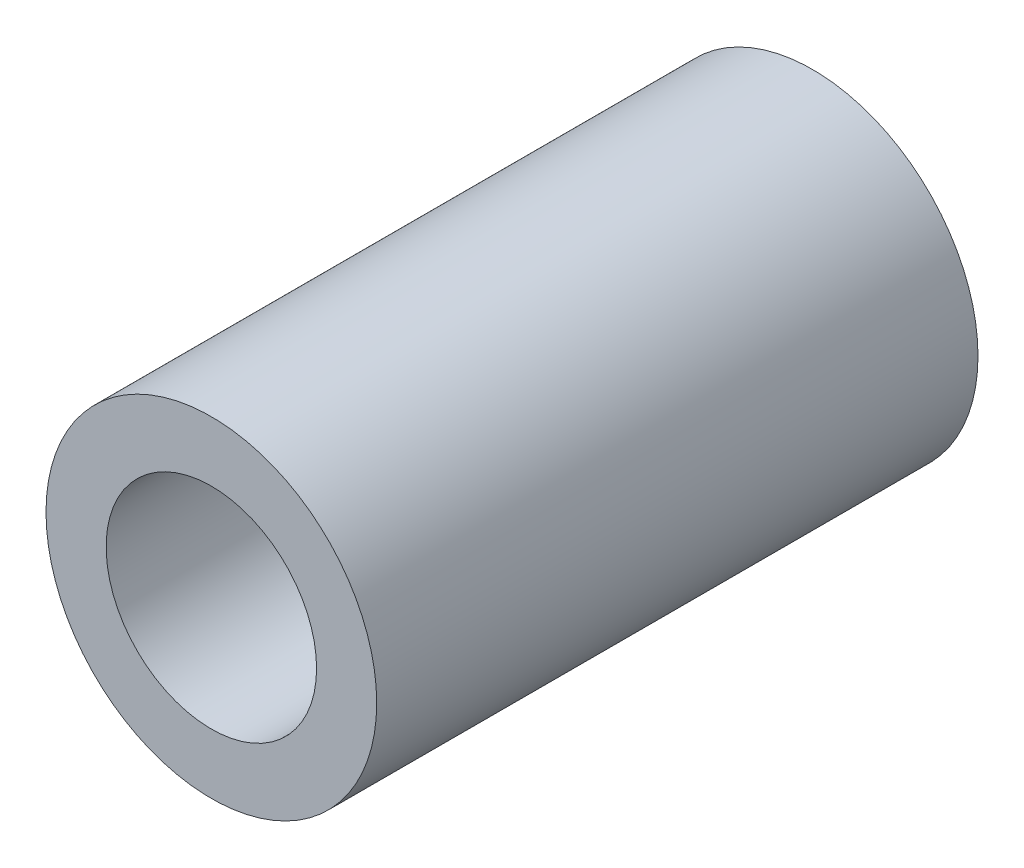
ISO-10303-21;
HEADER;
FILE_DESCRIPTION(('STEP AP214'),'2;1');
FILE_NAME('part.step','',(''),(''),'','','');
FILE_SCHEMA(('AUTOMOTIVE_DESIGN { 1 0 10303 214 1 1 1 1 }'));
ENDSEC;
DATA;
#1=APPLICATION_CONTEXT('core data for automotive mechanical design processes');
#2=APPLICATION_PROTOCOL_DEFINITION('international standard','automotive_design',2000,#1);
#3=PRODUCT_CONTEXT('',#1,'mechanical');
#4=PRODUCT('Part','Part','',(#3));
#5=PRODUCT_RELATED_PRODUCT_CATEGORY('part','',(#4));
#6=PRODUCT_DEFINITION_FORMATION('','',#4);
#7=PRODUCT_DEFINITION_CONTEXT('part definition',#1,'design');
#8=PRODUCT_DEFINITION('design','',#6,#7);
#9=PRODUCT_DEFINITION_SHAPE('','',#8);
#10=(LENGTH_UNIT() NAMED_UNIT(*) SI_UNIT(.MILLI.,.METRE.));
#11=(NAMED_UNIT(*) PLANE_ANGLE_UNIT() SI_UNIT($,.RADIAN.));
#12=(NAMED_UNIT(*) SI_UNIT($,.STERADIAN.) SOLID_ANGLE_UNIT());
#13=UNCERTAINTY_MEASURE_WITH_UNIT(LENGTH_MEASURE(1.E-05),#10,'distance_accuracy_value','');
#14=(GEOMETRIC_REPRESENTATION_CONTEXT(3) GLOBAL_UNCERTAINTY_ASSIGNED_CONTEXT((#13)) GLOBAL_UNIT_ASSIGNED_CONTEXT((#10,
#11,#12)) REPRESENTATION_CONTEXT('',''));
#15=CARTESIAN_POINT('',(0.,0.,0.));
#16=DIRECTION('',(0.,0.,1.));
#17=DIRECTION('',(1.,0.,0.));
#18=AXIS2_PLACEMENT_3D('',#15,#16,#17);
#19=CARTESIAN_POINT('',(0.,0.,20.));
#20=DIRECTION('',(0.,0.,-1.));
#21=DIRECTION('',(-1.,0.,0.));
#22=AXIS2_PLACEMENT_3D('',#19,#20,#21);
#23=CYLINDRICAL_SURFACE('',#22,2.5);
#24=CARTESIAN_POINT('',(0.,0.,0.));
#25=DIRECTION('',(0.,0.,1.));
#26=DIRECTION('',(1.,0.,0.));
#27=AXIS2_PLACEMENT_3D('',#24,#25,#26);
#28=CIRCLE('',#27,2.5);
#29=CARTESIAN_POINT('',(2.5,0.,0.));
#30=VERTEX_POINT('',#29);
#31=EDGE_CURVE('E41',#30,#30,#28,.T.);
#32=ORIENTED_EDGE('',*,*,#31,.F.);
#33=EDGE_LOOP('',(#32));
#34=FACE_BOUND('',#33,.T.);
#35=CARTESIAN_POINT('',(0.,0.,3.));
#36=DIRECTION('',(0.,0.,1.));
#37=DIRECTION('',(1.,0.,0.));
#38=AXIS2_PLACEMENT_3D('',#35,#36,#37);
#39=CIRCLE('',#38,2.5);
#40=CARTESIAN_POINT('',(2.5,0.,3.));
#41=VERTEX_POINT('',#40);
#42=EDGE_CURVE('E45',#41,#41,#39,.T.);
#43=ORIENTED_EDGE('',*,*,#42,.T.);
#44=EDGE_LOOP('',(#43));
#45=FACE_BOUND('',#44,.T.);
#46=ADVANCED_FACE('F30',(#34,#45),#23,.F.);
#47=CARTESIAN_POINT('',(0.,0.,20.));
#48=DIRECTION('',(0.,0.,1.));
#49=DIRECTION('',(1.,0.,0.));
#50=AXIS2_PLACEMENT_3D('',#47,#48,#49);
#51=PLANE('',#50);
#52=CARTESIAN_POINT('',(0.,0.,20.));
#53=DIRECTION('',(0.,0.,1.));
#54=DIRECTION('',(1.,0.,0.));
#55=AXIS2_PLACEMENT_3D('',#52,#53,#54);
#56=CIRCLE('',#55,3.5);
#57=CARTESIAN_POINT('',(3.5,0.,20.));
#58=VERTEX_POINT('',#57);
#59=EDGE_CURVE('E57',#58,#58,#56,.T.);
#60=ORIENTED_EDGE('',*,*,#59,.F.);
#61=EDGE_LOOP('',(#60));
#62=FACE_BOUND('',#61,.T.);
#63=CARTESIAN_POINT('',(0.,0.,20.));
#64=DIRECTION('',(0.,0.,1.));
#65=DIRECTION('',(1.,0.,0.));
#66=AXIS2_PLACEMENT_3D('',#63,#64,#65);
#67=CIRCLE('',#66,5.5);
#68=CARTESIAN_POINT('',(5.5,0.,20.));
#69=VERTEX_POINT('',#68);
#70=EDGE_CURVE('E10',#69,#69,#67,.T.);
#71=ORIENTED_EDGE('',*,*,#70,.T.);
#72=EDGE_LOOP('',(#71));
#73=FACE_BOUND('',#72,.T.);
#74=ADVANCED_FACE('F63',(#62,#73),#51,.T.);
#75=CARTESIAN_POINT('',(0.,0.,0.));
#76=DIRECTION('',(0.,0.,1.));
#77=DIRECTION('',(1.,0.,0.));
#78=AXIS2_PLACEMENT_3D('',#75,#76,#77);
#79=PLANE('',#78);
#80=CARTESIAN_POINT('',(0.,0.,0.));
#81=DIRECTION('',(0.,0.,1.));
#82=DIRECTION('',(1.,0.,0.));
#83=AXIS2_PLACEMENT_3D('',#80,#81,#82);
#84=CIRCLE('',#83,5.5);
#85=CARTESIAN_POINT('',(5.5,0.,0.));
#86=VERTEX_POINT('',#85);
#87=EDGE_CURVE('E34',#86,#86,#84,.T.);
#88=ORIENTED_EDGE('',*,*,#87,.F.);
#89=EDGE_LOOP('',(#88));
#90=FACE_BOUND('',#89,.T.);
#91=ORIENTED_EDGE('',*,*,#31,.T.);
#92=EDGE_LOOP('',(#91));
#93=FACE_BOUND('',#92,.T.);
#94=ADVANCED_FACE('F65',(#90,#93),#79,.F.);
#95=CARTESIAN_POINT('',(0.,0.,20.));
#96=DIRECTION('',(0.,0.,-1.));
#97=DIRECTION('',(-1.,0.,0.));
#98=AXIS2_PLACEMENT_3D('',#95,#96,#97);
#99=CYLINDRICAL_SURFACE('',#98,5.5);
#100=ORIENTED_EDGE('',*,*,#70,.F.);
#101=EDGE_LOOP('',(#100));
#102=FACE_BOUND('',#101,.T.);
#103=ORIENTED_EDGE('',*,*,#87,.T.);
#104=EDGE_LOOP('',(#103));
#105=FACE_BOUND('',#104,.T.);
#106=ADVANCED_FACE('F32',(#102,#105),#99,.T.);
#107=CARTESIAN_POINT('',(0.,0.,5.));
#108=DIRECTION('',(0.,0.,1.));
#109=DIRECTION('',(1.,0.,0.));
#110=AXIS2_PLACEMENT_3D('',#107,#108,#109);
#111=PLANE('',#110);
#112=CARTESIAN_POINT('',(0.,0.,5.));
#113=DIRECTION('',(0.,0.,1.));
#114=DIRECTION('',(1.,0.,0.));
#115=AXIS2_PLACEMENT_3D('',#112,#113,#114);
#116=CIRCLE('',#115,1.);
#117=CARTESIAN_POINT('',(1.,0.,5.));
#118=VERTEX_POINT('',#117);
#119=EDGE_CURVE('E49',#118,#118,#116,.T.);
#120=ORIENTED_EDGE('',*,*,#119,.F.);
#121=EDGE_LOOP('',(#120));
#122=FACE_BOUND('',#121,.T.);
#123=CARTESIAN_POINT('',(0.,0.,5.));
#124=DIRECTION('',(0.,0.,1.));
#125=DIRECTION('',(1.,0.,0.));
#126=AXIS2_PLACEMENT_3D('',#123,#124,#125);
#127=CIRCLE('',#126,3.5);
#128=CARTESIAN_POINT('',(3.5,0.,5.));
#129=VERTEX_POINT('',#128);
#130=EDGE_CURVE('E52',#129,#129,#127,.F.);
#131=ORIENTED_EDGE('',*,*,#130,.F.);
#132=EDGE_LOOP('',(#131));
#133=FACE_BOUND('',#132,.T.);
#134=ADVANCED_FACE('F75',(#122,#133),#111,.T.);
#135=CARTESIAN_POINT('',(0.,0.,3.));
#136=DIRECTION('',(0.,0.,1.));
#137=DIRECTION('',(1.,0.,0.));
#138=AXIS2_PLACEMENT_3D('',#135,#136,#137);
#139=PLANE('',#138);
#140=CARTESIAN_POINT('',(0.,0.,3.));
#141=DIRECTION('',(0.,0.,1.));
#142=DIRECTION('',(1.,0.,0.));
#143=AXIS2_PLACEMENT_3D('',#140,#141,#142);
#144=CIRCLE('',#143,1.);
#145=CARTESIAN_POINT('',(1.,0.,3.));
#146=VERTEX_POINT('',#145);
#147=EDGE_CURVE('E48',#146,#146,#144,.T.);
#148=ORIENTED_EDGE('',*,*,#147,.T.);
#149=EDGE_LOOP('',(#148));
#150=FACE_BOUND('',#149,.T.);
#151=ORIENTED_EDGE('',*,*,#42,.F.);
#152=EDGE_LOOP('',(#151));
#153=FACE_BOUND('',#152,.T.);
#154=ADVANCED_FACE('F78',(#150,#153),#139,.F.);
#155=CARTESIAN_POINT('',(0.,0.,3.));
#156=DIRECTION('',(0.,0.,1.));
#157=DIRECTION('',(1.,0.,0.));
#158=AXIS2_PLACEMENT_3D('',#155,#156,#157);
#159=CYLINDRICAL_SURFACE('',#158,1.);
#160=ORIENTED_EDGE('',*,*,#147,.F.);
#161=EDGE_LOOP('',(#160));
#162=FACE_BOUND('',#161,.T.);
#163=ORIENTED_EDGE('',*,*,#119,.T.);
#164=EDGE_LOOP('',(#163));
#165=FACE_BOUND('',#164,.T.);
#166=ADVANCED_FACE('F82',(#162,#165),#159,.F.);
#167=CARTESIAN_POINT('',(0.,0.,-4.89949493661166));
#168=DIRECTION('',(0.,0.,1.));
#169=DIRECTION('',(1.,0.,0.));
#170=AXIS2_PLACEMENT_3D('',#167,#168,#169);
#171=CYLINDRICAL_SURFACE('',#170,3.5);
#172=ORIENTED_EDGE('',*,*,#130,.T.);
#173=EDGE_LOOP('',(#172));
#174=FACE_BOUND('',#173,.T.);
#175=ORIENTED_EDGE('',*,*,#59,.T.);
#176=EDGE_LOOP('',(#175));
#177=FACE_BOUND('',#176,.T.);
#178=ADVANCED_FACE('F61',(#174,#177),#171,.F.);
#179=CLOSED_SHELL('',(#46,#74,#94,#106,#134,#154,#166,#178));
#180=MANIFOLD_SOLID_BREP('B2',#179);
#181=ADVANCED_BREP_SHAPE_REPRESENTATION('',(#18,#180),#14);
#182=SHAPE_DEFINITION_REPRESENTATION(#9,#181);
ENDSEC;
END-ISO-10303-21;
